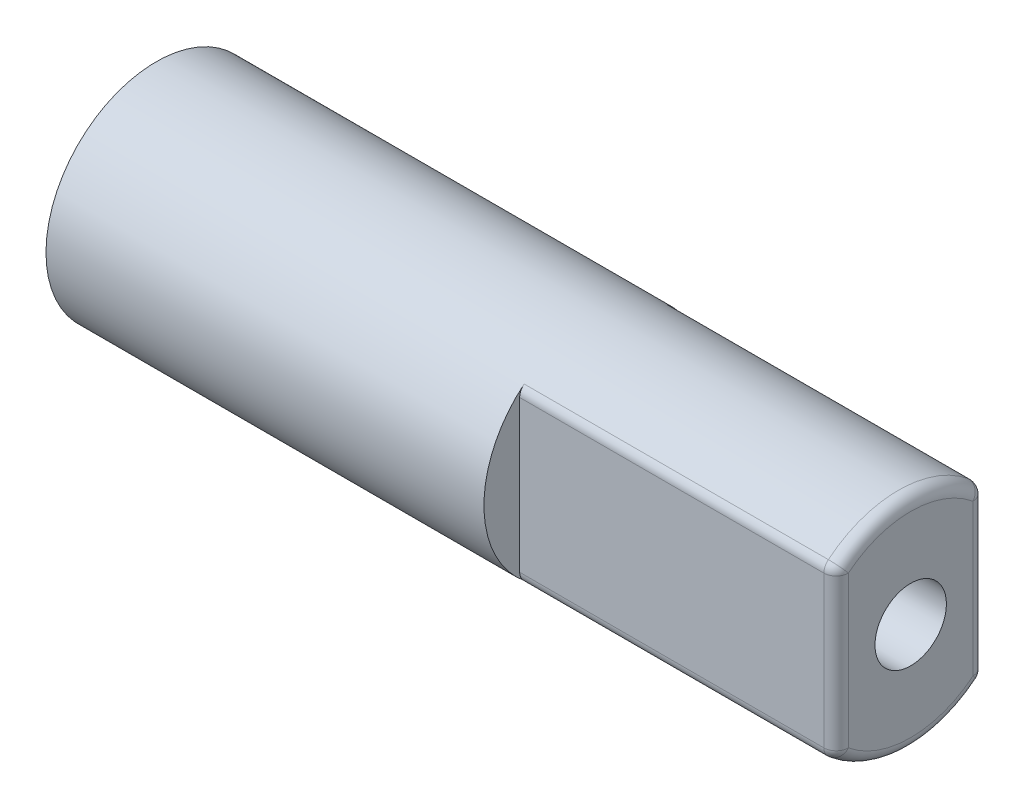
ISO-10303-21;
HEADER;
FILE_DESCRIPTION(('STEP AP214'),'2;1');
FILE_NAME('part.step','',(''),(''),'','','');
FILE_SCHEMA(('AUTOMOTIVE_DESIGN { 1 0 10303 214 1 1 1 1 }'));
ENDSEC;
DATA;
#1=APPLICATION_CONTEXT('core data for automotive mechanical design processes');
#2=APPLICATION_PROTOCOL_DEFINITION('international standard','automotive_design',2000,#1);
#3=PRODUCT_CONTEXT('',#1,'mechanical');
#4=PRODUCT('Part','Part','',(#3));
#5=PRODUCT_RELATED_PRODUCT_CATEGORY('part','',(#4));
#6=PRODUCT_DEFINITION_FORMATION('','',#4);
#7=PRODUCT_DEFINITION_CONTEXT('part definition',#1,'design');
#8=PRODUCT_DEFINITION('design','',#6,#7);
#9=PRODUCT_DEFINITION_SHAPE('','',#8);
#10=(LENGTH_UNIT() NAMED_UNIT(*) SI_UNIT(.MILLI.,.METRE.));
#11=(NAMED_UNIT(*) PLANE_ANGLE_UNIT() SI_UNIT($,.RADIAN.));
#12=(NAMED_UNIT(*) SI_UNIT($,.STERADIAN.) SOLID_ANGLE_UNIT());
#13=UNCERTAINTY_MEASURE_WITH_UNIT(LENGTH_MEASURE(1.E-05),#10,'distance_accuracy_value','');
#14=(GEOMETRIC_REPRESENTATION_CONTEXT(3) GLOBAL_UNCERTAINTY_ASSIGNED_CONTEXT((#13)) GLOBAL_UNIT_ASSIGNED_CONTEXT((#10,
#11,#12)) REPRESENTATION_CONTEXT('',''));
#15=CARTESIAN_POINT('',(0.,0.,0.));
#16=DIRECTION('',(0.,0.,1.));
#17=DIRECTION('',(1.,0.,0.));
#18=AXIS2_PLACEMENT_3D('',#15,#16,#17);
#19=CARTESIAN_POINT('',(29.8470275107586,12.5547738734765,63.8097082241312));
#20=DIRECTION('',(-1.,0.,0.));
#21=DIRECTION('',(0.,0.,1.));
#22=AXIS2_PLACEMENT_3D('',#19,#20,#21);
#23=CYLINDRICAL_SURFACE('',#22,2.7);
#24=CARTESIAN_POINT('',(22.0970275107586,12.5547738734765,63.8097082241312));
#25=DIRECTION('',(1.,0.,0.));
#26=DIRECTION('',(0.,0.,-1.));
#27=AXIS2_PLACEMENT_3D('',#24,#25,#26);
#28=CIRCLE('',#27,2.7);
#29=CARTESIAN_POINT('',(22.0970275107586,10.4699163581112,62.0940832241312));
#30=VERTEX_POINT('',#29);
#31=CARTESIAN_POINT('',(22.0970275107586,14.6396313888417,62.0940832241312));
#32=VERTEX_POINT('',#31);
#33=EDGE_CURVE('E214',#30,#32,#28,.T.);
#34=ORIENTED_EDGE('',*,*,#33,.F.);
#35=DIRECTION('',(-1.,0.,0.));
#36=VECTOR('',#35,1.);
#37=CARTESIAN_POINT('',(29.8470275107586,10.4699163581112,62.0940832241312));
#38=LINE('',#37,#36);
#39=CARTESIAN_POINT('',(29.5470275107586,10.4699163581112,62.0940832241312));
#40=VERTEX_POINT('',#39);
#41=EDGE_CURVE('E172',#30,#40,#38,.F.);
#42=ORIENTED_EDGE('',*,*,#41,.T.);
#43=CARTESIAN_POINT('',(29.5470275107586,12.5547738734765,63.8097082241312));
#44=DIRECTION('',(1.,0.,0.));
#45=DIRECTION('',(0.,0.,-1.));
#46=AXIS2_PLACEMENT_3D('',#43,#44,#45);
#47=CIRCLE('',#46,2.7);
#48=CARTESIAN_POINT('',(29.5470275107586,10.4699163581112,65.5253332241312));
#49=VERTEX_POINT('',#48);
#50=EDGE_CURVE('E170',#40,#49,#47,.F.);
#51=ORIENTED_EDGE('',*,*,#50,.T.);
#52=DIRECTION('',(-1.,0.,0.));
#53=VECTOR('',#52,1.);
#54=CARTESIAN_POINT('',(29.8470275107586,10.4699163581112,65.5253332241312));
#55=LINE('',#54,#53);
#56=CARTESIAN_POINT('',(22.0970275107586,10.4699163581112,65.5253332241312));
#57=VERTEX_POINT('',#56);
#58=EDGE_CURVE('E167',#49,#57,#55,.T.);
#59=ORIENTED_EDGE('',*,*,#58,.T.);
#60=CARTESIAN_POINT('',(22.0970275107586,12.5547738734765,63.8097082241312));
#61=DIRECTION('',(1.,0.,0.));
#62=DIRECTION('',(0.,0.,-1.));
#63=AXIS2_PLACEMENT_3D('',#60,#61,#62);
#64=CIRCLE('',#63,2.7);
#65=CARTESIAN_POINT('',(22.0970275107586,14.6396313888417,65.5253332241312));
#66=VERTEX_POINT('',#65);
#67=EDGE_CURVE('E221',#66,#57,#64,.T.);
#68=ORIENTED_EDGE('',*,*,#67,.F.);
#69=DIRECTION('',(-1.,0.,0.));
#70=VECTOR('',#69,1.);
#71=CARTESIAN_POINT('',(29.8470275107586,14.6396313888417,65.5253332241312));
#72=LINE('',#71,#70);
#73=CARTESIAN_POINT('',(29.5470275107586,14.6396313888417,65.5253332241312));
#74=VERTEX_POINT('',#73);
#75=EDGE_CURVE('E160',#66,#74,#72,.F.);
#76=ORIENTED_EDGE('',*,*,#75,.T.);
#77=CARTESIAN_POINT('',(29.5470275107586,12.5547738734765,63.8097082241312));
#78=DIRECTION('',(1.,0.,0.));
#79=DIRECTION('',(0.,0.,-1.));
#80=AXIS2_PLACEMENT_3D('',#77,#78,#79);
#81=CIRCLE('',#80,2.7);
#82=CARTESIAN_POINT('',(29.5470275107586,14.6396313888417,62.0940832241312));
#83=VERTEX_POINT('',#82);
#84=EDGE_CURVE('E162',#74,#83,#81,.F.);
#85=ORIENTED_EDGE('',*,*,#84,.T.);
#86=DIRECTION('',(-1.,0.,0.));
#87=VECTOR('',#86,1.);
#88=CARTESIAN_POINT('',(29.8470275107586,14.6396313888417,62.0940832241312));
#89=LINE('',#88,#87);
#90=EDGE_CURVE('E164',#83,#32,#89,.T.);
#91=ORIENTED_EDGE('',*,*,#90,.T.);
#92=EDGE_LOOP('',(#34,#42,#51,#59,#68,#76,#85,#91));
#93=FACE_BOUND('',#92,.T.);
#94=CARTESIAN_POINT('',(11.3720275107586,12.5547738734765,63.8097082241312));
#95=DIRECTION('',(1.,0.,0.));
#96=DIRECTION('',(0.,0.,-1.));
#97=AXIS2_PLACEMENT_3D('',#94,#95,#96);
#98=CIRCLE('',#97,2.7);
#99=CARTESIAN_POINT('',(11.3720275107586,12.5547738734765,61.1097082241312));
#100=VERTEX_POINT('',#99);
#101=EDGE_CURVE('E144',#100,#100,#98,.T.);
#102=ORIENTED_EDGE('',*,*,#101,.T.);
#103=EDGE_LOOP('',(#102));
#104=FACE_BOUND('',#103,.T.);
#105=ADVANCED_FACE('F36',(#93,#104),#23,.T.);
#106=CARTESIAN_POINT('',(29.8470275107586,12.5547738734765,63.8097082241312));
#107=DIRECTION('',(1.,0.,0.));
#108=DIRECTION('',(0.,0.,-1.));
#109=AXIS2_PLACEMENT_3D('',#106,#107,#108);
#110=PLANE('',#109);
#111=CARTESIAN_POINT('',(29.8470275107586,12.5547738734765,63.8097082241312));
#112=DIRECTION('',(1.,0.,0.));
#113=DIRECTION('',(0.,0.,-1.));
#114=AXIS2_PLACEMENT_3D('',#111,#112,#113);
#115=CIRCLE('',#114,2.4);
#116=CARTESIAN_POINT('',(29.8470275107586,14.4079805538014,62.2847082241312));
#117=VERTEX_POINT('',#116);
#118=CARTESIAN_POINT('',(29.8470275107586,14.4079805538014,65.3347082241309));
#119=VERTEX_POINT('',#118);
#120=EDGE_CURVE('E149',#117,#119,#115,.T.);
#121=ORIENTED_EDGE('',*,*,#120,.T.);
#122=DIRECTION('',(0.,-1.,0.));
#123=VECTOR('',#122,1.);
#124=CARTESIAN_POINT('',(29.8470275107586,12.5547738734765,65.3347082241312));
#125=LINE('',#124,#123);
#126=CARTESIAN_POINT('',(29.8470275107586,10.7015671931515,65.3347082241309));
#127=VERTEX_POINT('',#126);
#128=EDGE_CURVE('E119',#119,#127,#125,.T.);
#129=ORIENTED_EDGE('',*,*,#128,.T.);
#130=CARTESIAN_POINT('',(29.8470275107586,12.5547738734765,63.8097082241312));
#131=DIRECTION('',(1.,0.,0.));
#132=DIRECTION('',(0.,0.,-1.));
#133=AXIS2_PLACEMENT_3D('',#130,#131,#132);
#134=CIRCLE('',#133,2.4);
#135=CARTESIAN_POINT('',(29.8470275107586,10.7015671931515,62.2847082241315));
#136=VERTEX_POINT('',#135);
#137=EDGE_CURVE('E137',#127,#136,#134,.T.);
#138=ORIENTED_EDGE('',*,*,#137,.T.);
#139=DIRECTION('',(0.,-1.,0.));
#140=VECTOR('',#139,1.);
#141=CARTESIAN_POINT('',(29.8470275107586,14.5445917043343,62.2847082241312));
#142=LINE('',#141,#140);
#143=EDGE_CURVE('E143',#136,#117,#142,.F.);
#144=ORIENTED_EDGE('',*,*,#143,.T.);
#145=EDGE_LOOP('',(#121,#129,#138,#144));
#146=FACE_BOUND('',#145,.T.);
#147=CARTESIAN_POINT('',(29.8470275107586,12.5547738734765,63.8097082241312));
#148=DIRECTION('',(1.,0.,0.));
#149=DIRECTION('',(0.,0.,-1.));
#150=AXIS2_PLACEMENT_3D('',#147,#148,#149);
#151=CIRCLE('',#150,0.875);
#152=CARTESIAN_POINT('',(29.8470275107586,12.5547738734765,62.9347082241312));
#153=VERTEX_POINT('',#152);
#154=EDGE_CURVE('E206',#153,#153,#151,.T.);
#155=ORIENTED_EDGE('',*,*,#154,.F.);
#156=EDGE_LOOP('',(#155));
#157=FACE_BOUND('',#156,.T.);
#158=ADVANCED_FACE('F146',(#146,#157),#110,.T.);
#159=CARTESIAN_POINT('',(11.3720275107586,12.5547738734765,63.8097082241312));
#160=DIRECTION('',(1.,0.,0.));
#161=DIRECTION('',(0.,0.,-1.));
#162=AXIS2_PLACEMENT_3D('',#159,#160,#161);
#163=PLANE('',#162);
#164=ORIENTED_EDGE('',*,*,#101,.F.);
#165=EDGE_LOOP('',(#164));
#166=FACE_BOUND('',#165,.T.);
#167=ADVANCED_FACE('F271',(#166),#163,.F.);
#168=CARTESIAN_POINT('',(22.0970275107586,12.5547738734765,65.6347082241312));
#169=DIRECTION('',(0.,0.,1.));
#170=DIRECTION('',(1.,0.,0.));
#171=AXIS2_PLACEMENT_3D('',#168,#169,#170);
#172=PLANE('',#171);
#173=DIRECTION('',(0.,-1.,0.));
#174=VECTOR('',#173,1.);
#175=CARTESIAN_POINT('',(22.0970275107586,12.5547738734765,65.6347082241312));
#176=LINE('',#175,#174);
#177=CARTESIAN_POINT('',(22.0970275107586,14.4079805538011,65.6347082241312));
#178=VERTEX_POINT('',#177);
#179=CARTESIAN_POINT('',(22.0970275107586,10.7015671931518,65.6347082241312));
#180=VERTEX_POINT('',#179);
#181=EDGE_CURVE('E218',#178,#180,#176,.T.);
#182=ORIENTED_EDGE('',*,*,#181,.T.);
#183=DIRECTION('',(1.,0.,0.));
#184=VECTOR('',#183,1.);
#185=CARTESIAN_POINT('',(29.8470275107586,10.7015671931518,65.6347082241312));
#186=LINE('',#185,#184);
#187=CARTESIAN_POINT('',(29.5470275107586,10.7015671931518,65.6347082241312));
#188=VERTEX_POINT('',#187);
#189=EDGE_CURVE('E158',#180,#188,#186,.T.);
#190=ORIENTED_EDGE('',*,*,#189,.T.);
#191=DIRECTION('',(0.,-1.,0.));
#192=VECTOR('',#191,1.);
#193=CARTESIAN_POINT('',(29.5470275107586,12.5547738734765,65.6347082241312));
#194=LINE('',#193,#192);
#195=CARTESIAN_POINT('',(29.5470275107586,14.4079805538011,65.6347082241312));
#196=VERTEX_POINT('',#195);
#197=EDGE_CURVE('E121',#188,#196,#194,.F.);
#198=ORIENTED_EDGE('',*,*,#197,.T.);
#199=DIRECTION('',(1.,0.,0.));
#200=VECTOR('',#199,1.);
#201=CARTESIAN_POINT('',(22.0970275107586,14.4079805538011,65.6347082241312));
#202=LINE('',#201,#200);
#203=EDGE_CURVE('E151',#196,#178,#202,.F.);
#204=ORIENTED_EDGE('',*,*,#203,.T.);
#205=EDGE_LOOP('',(#182,#190,#198,#204));
#206=FACE_BOUND('',#205,.T.);
#207=ADVANCED_FACE('F243',(#206),#172,.T.);
#208=CARTESIAN_POINT('',(22.0970275107586,12.5547738734765,63.8097082241312));
#209=DIRECTION('',(1.,0.,0.));
#210=DIRECTION('',(0.,0.,-1.));
#211=AXIS2_PLACEMENT_3D('',#208,#209,#210);
#212=PLANE('',#211);
#213=ORIENTED_EDGE('',*,*,#181,.F.);
#214=CARTESIAN_POINT('',(22.0970275107586,14.4079805538011,65.3347082241312));
#215=DIRECTION('',(1.,0.,0.));
#216=DIRECTION('',(0.,0.,-1.));
#217=AXIS2_PLACEMENT_3D('',#214,#215,#216);
#218=CIRCLE('',#217,0.3);
#219=EDGE_CURVE('E11',#178,#66,#218,.F.);
#220=ORIENTED_EDGE('',*,*,#219,.T.);
#221=ORIENTED_EDGE('',*,*,#67,.T.);
#222=CARTESIAN_POINT('',(22.0970275107586,10.7015671931518,65.3347082241312));
#223=DIRECTION('',(1.,0.,0.));
#224=DIRECTION('',(0.,0.,-1.));
#225=AXIS2_PLACEMENT_3D('',#222,#223,#224);
#226=CIRCLE('',#225,0.3);
#227=EDGE_CURVE('E45',#57,#180,#226,.F.);
#228=ORIENTED_EDGE('',*,*,#227,.T.);
#229=EDGE_LOOP('',(#213,#220,#221,#228));
#230=FACE_BOUND('',#229,.T.);
#231=ADVANCED_FACE('F381',(#230),#212,.T.);
#232=CARTESIAN_POINT('',(22.0970275107586,12.5547738734765,63.8097082241312));
#233=DIRECTION('',(1.,0.,0.));
#234=DIRECTION('',(0.,0.,-1.));
#235=AXIS2_PLACEMENT_3D('',#232,#233,#234);
#236=CYLINDRICAL_SURFACE('',#235,0.875);
#237=CARTESIAN_POINT('',(22.0970275107586,12.5547738734765,63.8097082241312));
#238=DIRECTION('',(1.,0.,0.));
#239=DIRECTION('',(0.,0.,-1.));
#240=AXIS2_PLACEMENT_3D('',#237,#238,#239);
#241=CIRCLE('',#240,0.875);
#242=CARTESIAN_POINT('',(22.0970275107586,12.5547738734765,62.9347082241312));
#243=VERTEX_POINT('',#242);
#244=EDGE_CURVE('E209',#243,#243,#241,.T.);
#245=ORIENTED_EDGE('',*,*,#244,.F.);
#246=EDGE_LOOP('',(#245));
#247=FACE_BOUND('',#246,.T.);
#248=ORIENTED_EDGE('',*,*,#154,.T.);
#249=EDGE_LOOP('',(#248));
#250=FACE_BOUND('',#249,.T.);
#251=ADVANCED_FACE('F372',(#247,#250),#236,.F.);
#252=CARTESIAN_POINT('',(22.0970275107586,12.5547738734765,63.8097082241312));
#253=DIRECTION('',(1.,0.,0.));
#254=DIRECTION('',(0.,0.,-1.));
#255=AXIS2_PLACEMENT_3D('',#252,#253,#254);
#256=PLANE('',#255);
#257=ORIENTED_EDGE('',*,*,#244,.T.);
#258=EDGE_LOOP('',(#257));
#259=FACE_BOUND('',#258,.T.);
#260=ADVANCED_FACE('F364',(#259),#256,.T.);
#261=CARTESIAN_POINT('',(22.0970275107586,12.5547738734765,61.9847082241312));
#262=DIRECTION('',(0.,0.,1.));
#263=DIRECTION('',(1.,0.,0.));
#264=AXIS2_PLACEMENT_3D('',#261,#262,#263);
#265=PLANE('',#264);
#266=DIRECTION('',(0.,-1.,0.));
#267=VECTOR('',#266,1.);
#268=CARTESIAN_POINT('',(22.0970275107586,12.5547738734765,61.9847082241312));
#269=LINE('',#268,#267);
#270=CARTESIAN_POINT('',(22.0970275107586,14.4079805538011,61.9847082241312));
#271=VERTEX_POINT('',#270);
#272=CARTESIAN_POINT('',(22.0970275107586,10.7015671931518,61.9847082241312));
#273=VERTEX_POINT('',#272);
#274=EDGE_CURVE('E222',#271,#273,#269,.T.);
#275=ORIENTED_EDGE('',*,*,#274,.F.);
#276=DIRECTION('',(-1.,0.,0.));
#277=VECTOR('',#276,1.);
#278=CARTESIAN_POINT('',(22.0970275107586,14.4079805538011,61.9847082241312));
#279=LINE('',#278,#277);
#280=CARTESIAN_POINT('',(29.5470275107586,14.4079805538011,61.9847082241312));
#281=VERTEX_POINT('',#280);
#282=EDGE_CURVE('E53',#271,#281,#279,.F.);
#283=ORIENTED_EDGE('',*,*,#282,.T.);
#284=DIRECTION('',(0.,-1.,0.));
#285=VECTOR('',#284,1.);
#286=CARTESIAN_POINT('',(29.5470275107586,10.5649560426186,61.9847082241312));
#287=LINE('',#286,#285);
#288=CARTESIAN_POINT('',(29.5470275107586,10.7015671931518,61.9847082241312));
#289=VERTEX_POINT('',#288);
#290=EDGE_CURVE('E57',#281,#289,#287,.T.);
#291=ORIENTED_EDGE('',*,*,#290,.T.);
#292=DIRECTION('',(-1.,0.,0.));
#293=VECTOR('',#292,1.);
#294=CARTESIAN_POINT('',(22.0970275107586,10.7015671931518,61.9847082241312));
#295=LINE('',#294,#293);
#296=EDGE_CURVE('E174',#289,#273,#295,.T.);
#297=ORIENTED_EDGE('',*,*,#296,.T.);
#298=EDGE_LOOP('',(#275,#283,#291,#297));
#299=FACE_BOUND('',#298,.T.);
#300=ADVANCED_FACE('F355',(#299),#265,.F.);
#301=CARTESIAN_POINT('',(22.0970275107586,12.5547738734765,63.8097082241312));
#302=DIRECTION('',(1.,0.,0.));
#303=DIRECTION('',(0.,0.,-1.));
#304=AXIS2_PLACEMENT_3D('',#301,#302,#303);
#305=PLANE('',#304);
#306=ORIENTED_EDGE('',*,*,#33,.T.);
#307=CARTESIAN_POINT('',(22.0970275107586,14.4079805538011,62.2847082241312));
#308=DIRECTION('',(1.,0.,0.));
#309=DIRECTION('',(0.,0.,-1.));
#310=AXIS2_PLACEMENT_3D('',#307,#308,#309);
#311=CIRCLE('',#310,0.3);
#312=EDGE_CURVE('E178',#32,#271,#311,.F.);
#313=ORIENTED_EDGE('',*,*,#312,.T.);
#314=ORIENTED_EDGE('',*,*,#274,.T.);
#315=CARTESIAN_POINT('',(22.0970275107586,10.7015671931518,62.2847082241312));
#316=DIRECTION('',(1.,0.,0.));
#317=DIRECTION('',(0.,0.,-1.));
#318=AXIS2_PLACEMENT_3D('',#315,#316,#317);
#319=CIRCLE('',#318,0.3);
#320=EDGE_CURVE('E180',#273,#30,#319,.F.);
#321=ORIENTED_EDGE('',*,*,#320,.T.);
#322=EDGE_LOOP('',(#306,#313,#314,#321));
#323=FACE_BOUND('',#322,.T.);
#324=ADVANCED_FACE('F347',(#323),#305,.T.);
#325=CARTESIAN_POINT('',(29.8470275107586,14.4079805538011,62.2847082241312));
#326=DIRECTION('',(-1.,0.,0.));
#327=DIRECTION('',(0.,0.,1.));
#328=AXIS2_PLACEMENT_3D('',#325,#326,#327);
#329=CYLINDRICAL_SURFACE('',#328,0.3);
#330=ORIENTED_EDGE('',*,*,#312,.F.);
#331=ORIENTED_EDGE('',*,*,#90,.F.);
#332=CARTESIAN_POINT('',(29.5470275107586,14.4079805538011,62.2847082241312));
#333=DIRECTION('',(1.,0.,0.));
#334=DIRECTION('',(0.,0.,-1.));
#335=AXIS2_PLACEMENT_3D('',#332,#333,#334);
#336=CIRCLE('',#335,0.3);
#337=EDGE_CURVE('E40',#281,#83,#336,.T.);
#338=ORIENTED_EDGE('',*,*,#337,.F.);
#339=ORIENTED_EDGE('',*,*,#282,.F.);
#340=EDGE_LOOP('',(#330,#331,#338,#339));
#341=FACE_BOUND('',#340,.T.);
#342=ADVANCED_FACE('F38',(#341),#329,.T.);
#343=CARTESIAN_POINT('',(29.5470275107586,12.5547738734765,62.2847082241312));
#344=DIRECTION('',(0.,1.,0.));
#345=DIRECTION('',(0.,0.,1.));
#346=AXIS2_PLACEMENT_3D('',#343,#344,#345);
#347=CYLINDRICAL_SURFACE('',#346,0.3);
#348=CARTESIAN_POINT('',(29.5470275107586,10.7015671931518,62.2847082241312));
#349=DIRECTION('',(-2.06648934075736E-12,-1.,0.));
#350=DIRECTION('',(1.,-2.06648934075736E-12,0.));
#351=AXIS2_PLACEMENT_3D('',#348,#349,#350);
#352=CIRCLE('',#351,0.3);
#353=EDGE_CURVE('E198',#289,#136,#352,.T.);
#354=ORIENTED_EDGE('',*,*,#353,.F.);
#355=ORIENTED_EDGE('',*,*,#290,.F.);
#356=CARTESIAN_POINT('',(29.5470275107586,14.4079805538014,62.2847082241312));
#357=DIRECTION('',(0.,1.,-8.35558474262162E-13));
#358=DIRECTION('',(0.,8.35558474262162E-13,1.));
#359=AXIS2_PLACEMENT_3D('',#356,#357,#358);
#360=CIRCLE('',#359,0.3);
#361=EDGE_CURVE('E200',#117,#281,#360,.T.);
#362=ORIENTED_EDGE('',*,*,#361,.F.);
#363=ORIENTED_EDGE('',*,*,#143,.F.);
#364=EDGE_LOOP('',(#354,#355,#362,#363));
#365=FACE_BOUND('',#364,.T.);
#366=ADVANCED_FACE('F227',(#365),#347,.T.);
#367=CARTESIAN_POINT('',(29.8470275107586,10.7015671931518,62.2847082241312));
#368=DIRECTION('',(-1.,0.,0.));
#369=DIRECTION('',(0.,0.,1.));
#370=AXIS2_PLACEMENT_3D('',#367,#368,#369);
#371=CYLINDRICAL_SURFACE('',#370,0.3);
#372=ORIENTED_EDGE('',*,*,#320,.F.);
#373=ORIENTED_EDGE('',*,*,#296,.F.);
#374=CARTESIAN_POINT('',(29.5470275107586,10.7015671931518,62.2847082241312));
#375=DIRECTION('',(1.,0.,0.));
#376=DIRECTION('',(0.,0.,-1.));
#377=AXIS2_PLACEMENT_3D('',#374,#375,#376);
#378=CIRCLE('',#377,0.3);
#379=EDGE_CURVE('E195',#40,#289,#378,.T.);
#380=ORIENTED_EDGE('',*,*,#379,.F.);
#381=ORIENTED_EDGE('',*,*,#41,.F.);
#382=EDGE_LOOP('',(#372,#373,#380,#381));
#383=FACE_BOUND('',#382,.T.);
#384=ADVANCED_FACE('F255',(#383),#371,.T.);
#385=CARTESIAN_POINT('',(29.5470275107586,14.4079805538011,62.2847082241312));
#386=DIRECTION('',(0.,0.,1.));
#387=DIRECTION('',(1.,0.,0.));
#388=AXIS2_PLACEMENT_3D('',#385,#386,#387);
#389=SPHERICAL_SURFACE('',#388,0.3);
#390=ORIENTED_EDGE('',*,*,#361,.T.);
#391=ORIENTED_EDGE('',*,*,#337,.T.);
#392=CARTESIAN_POINT('',(29.5470275107586,14.4079805538011,62.2847082241312));
#393=DIRECTION('',(1.31351815169721E-12,-0.635416666666666,-0.772169450135281));
#394=DIRECTION('',(0.,0.772169450135281,-0.635416666666666));
#395=AXIS2_PLACEMENT_3D('',#392,#393,#394);
#396=CIRCLE('',#395,0.3);
#397=EDGE_CURVE('E192',#117,#83,#396,.F.);
#398=ORIENTED_EDGE('',*,*,#397,.F.);
#399=EDGE_LOOP('',(#390,#391,#398));
#400=FACE_BOUND('',#399,.T.);
#401=ADVANCED_FACE('F228',(#400),#389,.T.);
#402=CARTESIAN_POINT('',(29.5470275107586,10.7015671931518,62.2847082241312));
#403=DIRECTION('',(0.,0.,1.));
#404=DIRECTION('',(1.,0.,0.));
#405=AXIS2_PLACEMENT_3D('',#402,#403,#404);
#406=SPHERICAL_SURFACE('',#405,0.3);
#407=ORIENTED_EDGE('',*,*,#379,.T.);
#408=ORIENTED_EDGE('',*,*,#353,.T.);
#409=CARTESIAN_POINT('',(29.5470275107586,10.7015671931515,62.2847082241315));
#410=DIRECTION('',(0.,0.63541666666768,-0.772169450134447));
#411=DIRECTION('',(0.,0.772169450134447,0.63541666666768));
#412=AXIS2_PLACEMENT_3D('',#409,#410,#411);
#413=CIRCLE('',#412,0.3);
#414=EDGE_CURVE('E140',#40,#136,#413,.F.);
#415=ORIENTED_EDGE('',*,*,#414,.F.);
#416=EDGE_LOOP('',(#407,#408,#415));
#417=FACE_BOUND('',#416,.T.);
#418=ADVANCED_FACE('F257',(#417),#406,.T.);
#419=CARTESIAN_POINT('',(29.8470275107586,14.4079805538011,65.3347082241312));
#420=DIRECTION('',(-1.,0.,0.));
#421=DIRECTION('',(0.,0.,1.));
#422=AXIS2_PLACEMENT_3D('',#419,#420,#421);
#423=CYLINDRICAL_SURFACE('',#422,0.3);
#424=ORIENTED_EDGE('',*,*,#219,.F.);
#425=ORIENTED_EDGE('',*,*,#203,.F.);
#426=CARTESIAN_POINT('',(29.5470275107586,14.4079805538011,65.3347082241312));
#427=DIRECTION('',(1.,0.,0.));
#428=DIRECTION('',(0.,0.,-1.));
#429=AXIS2_PLACEMENT_3D('',#426,#427,#428);
#430=CIRCLE('',#429,0.3);
#431=EDGE_CURVE('E188',#74,#196,#430,.T.);
#432=ORIENTED_EDGE('',*,*,#431,.F.);
#433=ORIENTED_EDGE('',*,*,#75,.F.);
#434=EDGE_LOOP('',(#424,#425,#432,#433));
#435=FACE_BOUND('',#434,.T.);
#436=ADVANCED_FACE('F240',(#435),#423,.T.);
#437=CARTESIAN_POINT('',(29.5470275107586,12.5547738734765,63.8097082241312));
#438=DIRECTION('',(1.,0.,0.));
#439=DIRECTION('',(0.,0.,-1.));
#440=AXIS2_PLACEMENT_3D('',#437,#438,#439);
#441=TOROIDAL_SURFACE('',#440,2.4,0.3);
#442=ORIENTED_EDGE('',*,*,#397,.T.);
#443=ORIENTED_EDGE('',*,*,#84,.F.);
#444=CARTESIAN_POINT('',(29.5470275107586,14.4079805538014,65.3347082241309));
#445=DIRECTION('',(0.,-0.63541666666768,0.772169450134447));
#446=DIRECTION('',(0.,-0.772169450134447,-0.63541666666768));
#447=AXIS2_PLACEMENT_3D('',#444,#445,#446);
#448=CIRCLE('',#447,0.3);
#449=EDGE_CURVE('E134',#119,#74,#448,.T.);
#450=ORIENTED_EDGE('',*,*,#449,.F.);
#451=ORIENTED_EDGE('',*,*,#120,.F.);
#452=EDGE_LOOP('',(#442,#443,#450,#451));
#453=FACE_BOUND('',#452,.T.);
#454=ADVANCED_FACE('F231',(#453),#441,.T.);
#455=CARTESIAN_POINT('',(29.5470275107586,12.5547738734765,63.8097082241312));
#456=DIRECTION('',(1.,0.,0.));
#457=DIRECTION('',(0.,0.,-1.));
#458=AXIS2_PLACEMENT_3D('',#455,#456,#457);
#459=TOROIDAL_SURFACE('',#458,2.4,0.3);
#460=ORIENTED_EDGE('',*,*,#414,.T.);
#461=ORIENTED_EDGE('',*,*,#137,.F.);
#462=CARTESIAN_POINT('',(29.5470275107586,10.7015671931518,65.3347082241312));
#463=DIRECTION('',(1.31351815169721E-12,0.635416666666666,0.772169450135281));
#464=DIRECTION('',(0.,-0.772169450135281,0.635416666666666));
#465=AXIS2_PLACEMENT_3D('',#462,#463,#464);
#466=CIRCLE('',#465,0.3);
#467=EDGE_CURVE('E127',#49,#127,#466,.T.);
#468=ORIENTED_EDGE('',*,*,#467,.F.);
#469=ORIENTED_EDGE('',*,*,#50,.F.);
#470=EDGE_LOOP('',(#460,#461,#468,#469));
#471=FACE_BOUND('',#470,.T.);
#472=ADVANCED_FACE('F138',(#471),#459,.T.);
#473=CARTESIAN_POINT('',(29.8470275107586,10.7015671931518,65.3347082241312));
#474=DIRECTION('',(-1.,0.,0.));
#475=DIRECTION('',(0.,0.,1.));
#476=AXIS2_PLACEMENT_3D('',#473,#474,#475);
#477=CYLINDRICAL_SURFACE('',#476,0.3);
#478=ORIENTED_EDGE('',*,*,#227,.F.);
#479=ORIENTED_EDGE('',*,*,#58,.F.);
#480=CARTESIAN_POINT('',(29.5470275107586,10.7015671931518,65.3347082241312));
#481=DIRECTION('',(1.,0.,0.));
#482=DIRECTION('',(0.,0.,-1.));
#483=AXIS2_PLACEMENT_3D('',#480,#481,#482);
#484=CIRCLE('',#483,0.3);
#485=EDGE_CURVE('E131',#188,#49,#484,.T.);
#486=ORIENTED_EDGE('',*,*,#485,.F.);
#487=ORIENTED_EDGE('',*,*,#189,.F.);
#488=EDGE_LOOP('',(#478,#479,#486,#487));
#489=FACE_BOUND('',#488,.T.);
#490=ADVANCED_FACE('F248',(#489),#477,.T.);
#491=CARTESIAN_POINT('',(29.5470275107586,14.4079805538011,65.3347082241312));
#492=DIRECTION('',(0.,0.,1.));
#493=DIRECTION('',(1.,0.,0.));
#494=AXIS2_PLACEMENT_3D('',#491,#492,#493);
#495=SPHERICAL_SURFACE('',#494,0.3);
#496=ORIENTED_EDGE('',*,*,#449,.T.);
#497=ORIENTED_EDGE('',*,*,#431,.T.);
#498=CARTESIAN_POINT('',(29.5470275107586,14.4079805538011,65.3347082241312));
#499=DIRECTION('',(-2.06648934075736E-12,1.,0.));
#500=DIRECTION('',(-1.,-2.06648934075736E-12,0.));
#501=AXIS2_PLACEMENT_3D('',#498,#499,#500);
#502=CIRCLE('',#501,0.3);
#503=EDGE_CURVE('E124',#119,#196,#502,.F.);
#504=ORIENTED_EDGE('',*,*,#503,.F.);
#505=EDGE_LOOP('',(#496,#497,#504));
#506=FACE_BOUND('',#505,.T.);
#507=ADVANCED_FACE('F235',(#506),#495,.T.);
#508=CARTESIAN_POINT('',(29.5470275107586,10.7015671931518,65.3347082241312));
#509=DIRECTION('',(0.,0.,1.));
#510=DIRECTION('',(1.,0.,0.));
#511=AXIS2_PLACEMENT_3D('',#508,#509,#510);
#512=SPHERICAL_SURFACE('',#511,0.3);
#513=ORIENTED_EDGE('',*,*,#485,.T.);
#514=ORIENTED_EDGE('',*,*,#467,.T.);
#515=CARTESIAN_POINT('',(29.5470275107586,10.7015671931512,65.3347082241312));
#516=DIRECTION('',(0.,-1.,2.06648934075737E-12));
#517=DIRECTION('',(0.,-2.06648934075737E-12,-1.));
#518=AXIS2_PLACEMENT_3D('',#515,#516,#517);
#519=CIRCLE('',#518,0.3);
#520=EDGE_CURVE('E115',#188,#127,#519,.F.);
#521=ORIENTED_EDGE('',*,*,#520,.F.);
#522=EDGE_LOOP('',(#513,#514,#521));
#523=FACE_BOUND('',#522,.T.);
#524=ADVANCED_FACE('F129',(#523),#512,.T.);
#525=CARTESIAN_POINT('',(29.5470275107586,12.5547738734765,65.3347082241312));
#526=DIRECTION('',(0.,-1.,0.));
#527=DIRECTION('',(0.,0.,-1.));
#528=AXIS2_PLACEMENT_3D('',#525,#526,#527);
#529=CYLINDRICAL_SURFACE('',#528,0.3);
#530=ORIENTED_EDGE('',*,*,#503,.T.);
#531=ORIENTED_EDGE('',*,*,#197,.F.);
#532=ORIENTED_EDGE('',*,*,#520,.T.);
#533=ORIENTED_EDGE('',*,*,#128,.F.);
#534=EDGE_LOOP('',(#530,#531,#532,#533));
#535=FACE_BOUND('',#534,.T.);
#536=ADVANCED_FACE('F117',(#535),#529,.T.);
#537=CLOSED_SHELL('',(#105,#158,#167,#207,#231,#251,#260,#300,#324,#342,#366,#384,#401,#418,
#436,#454,#472,#490,#507,#524,#536));
#538=MANIFOLD_SOLID_BREP('B2',#537);
#539=ADVANCED_BREP_SHAPE_REPRESENTATION('',(#18,#538),#14);
#540=SHAPE_DEFINITION_REPRESENTATION(#9,#539);
ENDSEC;
END-ISO-10303-21;
